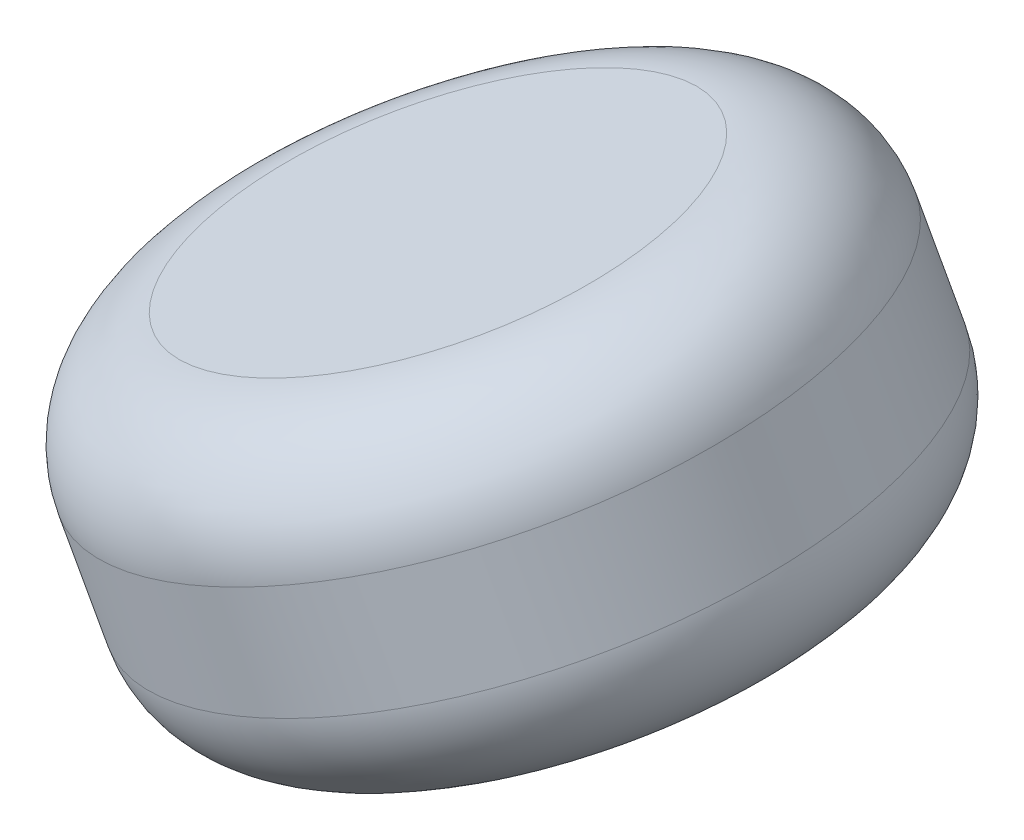
ISO-10303-21;
HEADER;
FILE_DESCRIPTION(('STEP AP214'),'2;1');
FILE_NAME('part.step','',(''),(''),'','','');
FILE_SCHEMA(('AUTOMOTIVE_DESIGN { 1 0 10303 214 1 1 1 1 }'));
ENDSEC;
DATA;
#1=APPLICATION_CONTEXT('core data for automotive mechanical design processes');
#2=APPLICATION_PROTOCOL_DEFINITION('international standard','automotive_design',2000,#1);
#3=PRODUCT_CONTEXT('',#1,'mechanical');
#4=PRODUCT('Part','Part','',(#3));
#5=PRODUCT_RELATED_PRODUCT_CATEGORY('part','',(#4));
#6=PRODUCT_DEFINITION_FORMATION('','',#4);
#7=PRODUCT_DEFINITION_CONTEXT('part definition',#1,'design');
#8=PRODUCT_DEFINITION('design','',#6,#7);
#9=PRODUCT_DEFINITION_SHAPE('','',#8);
#10=(LENGTH_UNIT() NAMED_UNIT(*) SI_UNIT(.MILLI.,.METRE.));
#11=(NAMED_UNIT(*) PLANE_ANGLE_UNIT() SI_UNIT($,.RADIAN.));
#12=(NAMED_UNIT(*) SI_UNIT($,.STERADIAN.) SOLID_ANGLE_UNIT());
#13=UNCERTAINTY_MEASURE_WITH_UNIT(LENGTH_MEASURE(1.E-05),#10,'distance_accuracy_value','');
#14=(GEOMETRIC_REPRESENTATION_CONTEXT(3) GLOBAL_UNCERTAINTY_ASSIGNED_CONTEXT((#13)) GLOBAL_UNIT_ASSIGNED_CONTEXT((#10,
#11,#12)) REPRESENTATION_CONTEXT('',''));
#15=CARTESIAN_POINT('',(0.,0.,0.));
#16=DIRECTION('',(0.,0.,1.));
#17=DIRECTION('',(1.,0.,0.));
#18=AXIS2_PLACEMENT_3D('',#15,#16,#17);
#19=CARTESIAN_POINT('',(-110.976436598543,292.051612395951,32.6641058110905));
#20=DIRECTION('',(0.353283309670283,-0.929719527714037,-0.103983185638832));
#21=DIRECTION('',(0.934786956174139,0.355208877375958,0.));
#22=AXIS2_PLACEMENT_3D('',#19,#20,#21);
#23=CYLINDRICAL_SURFACE('',#22,3.);
#24=CARTESIAN_POINT('',(-110.623153288873,291.121892868237,32.5601226254517));
#25=DIRECTION('',(0.353283309670283,-0.929719527714037,-0.103983185638832));
#26=DIRECTION('',(0.934786956174139,0.355208877375958,0.));
#27=AXIS2_PLACEMENT_3D('',#24,#25,#26);
#28=CIRCLE('',#27,3.);
#29=CARTESIAN_POINT('',(-107.81879242035,292.187519500365,32.5601226254517));
#30=VERTEX_POINT('',#29);
#31=EDGE_CURVE('E48',#30,#30,#28,.T.);
#32=ORIENTED_EDGE('',*,*,#31,.T.);
#33=EDGE_LOOP('',(#32));
#34=FACE_BOUND('',#33,.T.);
#35=CARTESIAN_POINT('',(-110.269869979202,290.192173340523,32.4561394398129));
#36=DIRECTION('',(0.353283309670283,-0.929719527714037,-0.103983185638832));
#37=DIRECTION('',(0.934786956174139,0.355208877375958,0.));
#38=AXIS2_PLACEMENT_3D('',#35,#36,#37);
#39=CIRCLE('',#38,3.);
#40=CARTESIAN_POINT('',(-107.46550911068,291.257799972651,32.4561394398129));
#41=VERTEX_POINT('',#40);
#42=EDGE_CURVE('E52',#41,#41,#39,.F.);
#43=ORIENTED_EDGE('',*,*,#42,.T.);
#44=EDGE_LOOP('',(#43));
#45=FACE_BOUND('',#44,.T.);
#46=ADVANCED_FACE('F37',(#34,#45),#23,.T.);
#47=CARTESIAN_POINT('',(-110.976436598543,292.051612395951,32.6641058110905));
#48=DIRECTION('',(0.353283309670283,-0.929719527714037,-0.103983185638832));
#49=DIRECTION('',(0.934786956174139,0.355208877375958,0.));
#50=AXIS2_PLACEMENT_3D('',#47,#48,#49);
#51=PLANE('',#50);
#52=CARTESIAN_POINT('',(-110.976436598543,292.051612395951,32.6641058110905));
#53=DIRECTION('',(0.353283309670283,-0.929719527714037,-0.103983185638832));
#54=DIRECTION('',(0.934786956174139,0.355208877375958,0.));
#55=AXIS2_PLACEMENT_3D('',#52,#53,#54);
#56=CIRCLE('',#55,2.);
#57=CARTESIAN_POINT('',(-109.106862686195,292.762030150703,32.6641058110905));
#58=VERTEX_POINT('',#57);
#59=EDGE_CURVE('E44',#58,#58,#56,.F.);
#60=ORIENTED_EDGE('',*,*,#59,.T.);
#61=EDGE_LOOP('',(#60));
#62=FACE_BOUND('',#61,.T.);
#63=ADVANCED_FACE('F68',(#62),#51,.F.);
#64=CARTESIAN_POINT('',(-109.916586669532,289.262453812809,32.352156254174));
#65=DIRECTION('',(0.353283309670283,-0.929719527714037,-0.103983185638832));
#66=DIRECTION('',(0.934786956174139,0.355208877375958,0.));
#67=AXIS2_PLACEMENT_3D('',#64,#65,#66);
#68=PLANE('',#67);
#69=CARTESIAN_POINT('',(-109.916586669532,289.262453812809,32.352156254174));
#70=DIRECTION('',(0.353283309670283,-0.929719527714037,-0.103983185638832));
#71=DIRECTION('',(0.934786956174139,0.355208877375958,0.));
#72=AXIS2_PLACEMENT_3D('',#69,#70,#71);
#73=CIRCLE('',#72,2.);
#74=CARTESIAN_POINT('',(-108.047012757184,289.97287156756,32.352156254174));
#75=VERTEX_POINT('',#74);
#76=EDGE_CURVE('E10',#75,#75,#73,.T.);
#77=ORIENTED_EDGE('',*,*,#76,.T.);
#78=EDGE_LOOP('',(#77));
#79=FACE_BOUND('',#78,.T.);
#80=ADVANCED_FACE('F65',(#79),#68,.T.);
#81=CARTESIAN_POINT('',(-110.623153288873,291.121892868237,32.5601226254517));
#82=DIRECTION('',(0.353283309670283,-0.929719527714037,-0.103983185638832));
#83=DIRECTION('',(0.934786956174139,0.355208877375958,0.));
#84=AXIS2_PLACEMENT_3D('',#81,#82,#83);
#85=TOROIDAL_SURFACE('',#84,2.,1.);
#86=ORIENTED_EDGE('',*,*,#59,.F.);
#87=EDGE_LOOP('',(#86));
#88=FACE_BOUND('',#87,.T.);
#89=ORIENTED_EDGE('',*,*,#31,.F.);
#90=EDGE_LOOP('',(#89));
#91=FACE_BOUND('',#90,.T.);
#92=ADVANCED_FACE('F61',(#88,#91),#85,.T.);
#93=CARTESIAN_POINT('',(-110.269869979202,290.192173340523,32.4561394398129));
#94=DIRECTION('',(0.353283309670283,-0.929719527714037,-0.103983185638832));
#95=DIRECTION('',(0.934786956174139,0.355208877375958,0.));
#96=AXIS2_PLACEMENT_3D('',#93,#94,#95);
#97=TOROIDAL_SURFACE('',#96,2.,1.);
#98=ORIENTED_EDGE('',*,*,#42,.F.);
#99=EDGE_LOOP('',(#98));
#100=FACE_BOUND('',#99,.T.);
#101=ORIENTED_EDGE('',*,*,#76,.F.);
#102=EDGE_LOOP('',(#101));
#103=FACE_BOUND('',#102,.T.);
#104=ADVANCED_FACE('F39',(#100,#103),#97,.T.);
#105=CLOSED_SHELL('',(#46,#63,#80,#92,#104));
#106=MANIFOLD_SOLID_BREP('B2',#105);
#107=ADVANCED_BREP_SHAPE_REPRESENTATION('',(#18,#106),#14);
#108=SHAPE_DEFINITION_REPRESENTATION(#9,#107);
ENDSEC;
END-ISO-10303-21;
